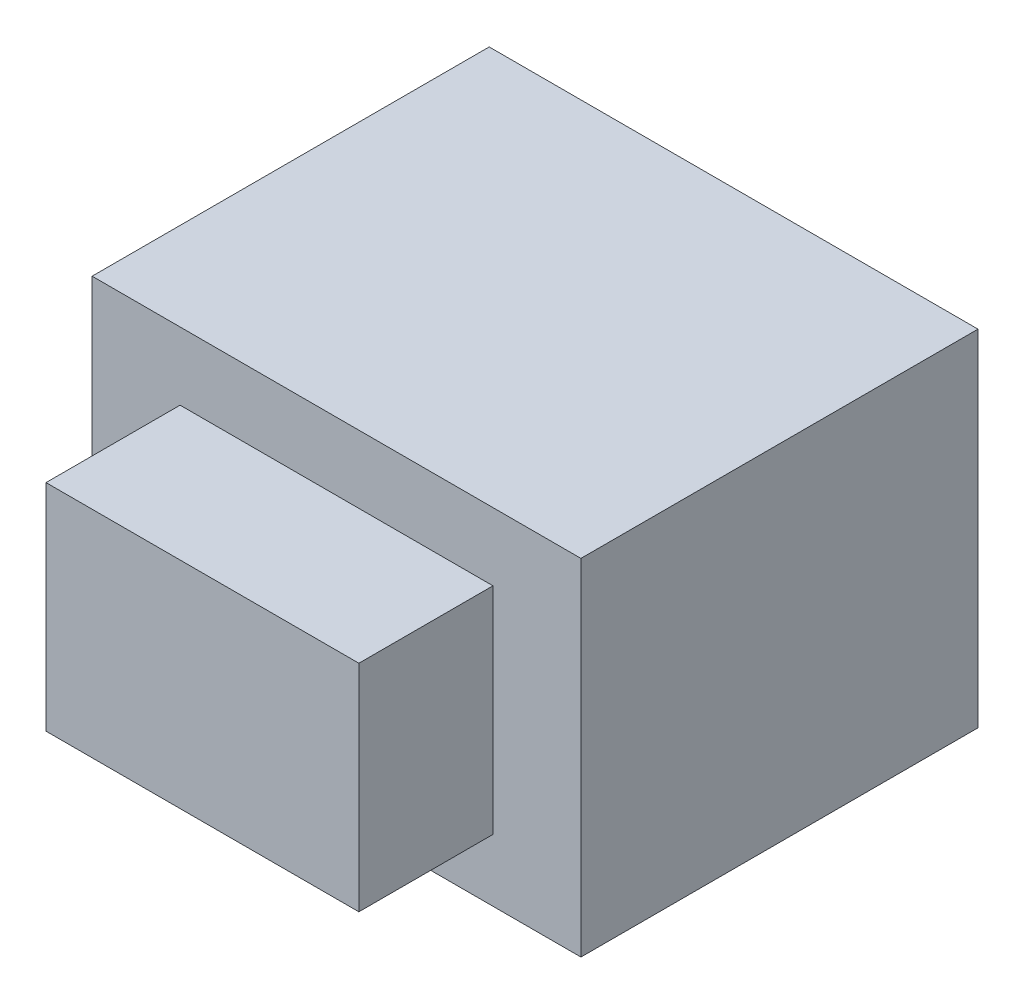
ISO-10303-21;
HEADER;
FILE_DESCRIPTION(('STEP AP214'),'2;1');
FILE_NAME('part.step','',(''),(''),'','','');
FILE_SCHEMA(('AUTOMOTIVE_DESIGN { 1 0 10303 214 1 1 1 1 }'));
ENDSEC;
DATA;
#1=APPLICATION_CONTEXT('core data for automotive mechanical design processes');
#2=APPLICATION_PROTOCOL_DEFINITION('international standard','automotive_design',2000,#1);
#3=PRODUCT_CONTEXT('',#1,'mechanical');
#4=PRODUCT('Part','Part','',(#3));
#5=PRODUCT_RELATED_PRODUCT_CATEGORY('part','',(#4));
#6=PRODUCT_DEFINITION_FORMATION('','',#4);
#7=PRODUCT_DEFINITION_CONTEXT('part definition',#1,'design');
#8=PRODUCT_DEFINITION('design','',#6,#7);
#9=PRODUCT_DEFINITION_SHAPE('','',#8);
#10=(LENGTH_UNIT() NAMED_UNIT(*) SI_UNIT(.MILLI.,.METRE.));
#11=(NAMED_UNIT(*) PLANE_ANGLE_UNIT() SI_UNIT($,.RADIAN.));
#12=(NAMED_UNIT(*) SI_UNIT($,.STERADIAN.) SOLID_ANGLE_UNIT());
#13=UNCERTAINTY_MEASURE_WITH_UNIT(LENGTH_MEASURE(1.E-05),#10,'distance_accuracy_value','');
#14=(GEOMETRIC_REPRESENTATION_CONTEXT(3) GLOBAL_UNCERTAINTY_ASSIGNED_CONTEXT((#13)) GLOBAL_UNIT_ASSIGNED_CONTEXT((#10,
#11,#12)) REPRESENTATION_CONTEXT('',''));
#15=CARTESIAN_POINT('',(0.,0.,0.));
#16=DIRECTION('',(0.,0.,1.));
#17=DIRECTION('',(1.,0.,0.));
#18=AXIS2_PLACEMENT_3D('',#15,#16,#17);
#19=CARTESIAN_POINT('',(0.,25.7503008676546,0.));
#20=DIRECTION('',(0.,0.,-1.));
#21=DIRECTION('',(-1.,0.,0.));
#22=AXIS2_PLACEMENT_3D('',#19,#20,#21);
#23=PLANE('',#22);
#24=DIRECTION('',(1.,0.,0.));
#25=VECTOR('',#24,1.);
#26=CARTESIAN_POINT('',(0.,0.,0.));
#27=LINE('',#26,#25);
#28=CARTESIAN_POINT('',(0.,0.,0.));
#29=VERTEX_POINT('',#28);
#30=CARTESIAN_POINT('',(36.453071333995,0.,0.));
#31=VERTEX_POINT('',#30);
#32=EDGE_CURVE('E139',#29,#31,#27,.T.);
#33=ORIENTED_EDGE('',*,*,#32,.T.);
#34=DIRECTION('',(0.,-1.,0.));
#35=VECTOR('',#34,1.);
#36=CARTESIAN_POINT('',(36.453071333995,25.7503008676546,0.));
#37=LINE('',#36,#35);
#38=CARTESIAN_POINT('',(36.453071333995,25.7503008676546,0.));
#39=VERTEX_POINT('',#38);
#40=EDGE_CURVE('E54',#39,#31,#37,.T.);
#41=ORIENTED_EDGE('',*,*,#40,.F.);
#42=DIRECTION('',(1.,0.,0.));
#43=VECTOR('',#42,1.);
#44=CARTESIAN_POINT('',(0.,25.7503008676546,0.));
#45=LINE('',#44,#43);
#46=CARTESIAN_POINT('',(0.,25.7503008676546,0.));
#47=VERTEX_POINT('',#46);
#48=EDGE_CURVE('E149',#47,#39,#45,.T.);
#49=ORIENTED_EDGE('',*,*,#48,.F.);
#50=DIRECTION('',(0.,-1.,0.));
#51=VECTOR('',#50,1.);
#52=CARTESIAN_POINT('',(0.,25.7503008676546,0.));
#53=LINE('',#52,#51);
#54=EDGE_CURVE('E11',#47,#29,#53,.T.);
#55=ORIENTED_EDGE('',*,*,#54,.T.);
#56=EDGE_LOOP('',(#33,#41,#49,#55));
#57=FACE_BOUND('',#56,.T.);
#58=DIRECTION('',(0.,-1.,0.));
#59=VECTOR('',#58,1.);
#60=CARTESIAN_POINT('',(6.55998389330817,20.6990312634811,0.));
#61=LINE('',#60,#59);
#62=CARTESIAN_POINT('',(6.55998389330817,20.6990312634811,0.));
#63=VERTEX_POINT('',#62);
#64=CARTESIAN_POINT('',(6.55998389330817,4.64308377295819,0.));
#65=VERTEX_POINT('',#64);
#66=EDGE_CURVE('E61',#63,#65,#61,.T.);
#67=ORIENTED_EDGE('',*,*,#66,.F.);
#68=DIRECTION('',(-1.,0.,0.));
#69=VECTOR('',#68,1.);
#70=CARTESIAN_POINT('',(6.55998389330817,20.6990312634811,0.));
#71=LINE('',#70,#69);
#72=CARTESIAN_POINT('',(29.8930874406869,20.6990312634811,0.));
#73=VERTEX_POINT('',#72);
#74=EDGE_CURVE('E65',#73,#63,#71,.T.);
#75=ORIENTED_EDGE('',*,*,#74,.F.);
#76=DIRECTION('',(0.,1.,0.));
#77=VECTOR('',#76,1.);
#78=CARTESIAN_POINT('',(29.8930874406869,20.6990312634811,0.));
#79=LINE('',#78,#77);
#80=CARTESIAN_POINT('',(29.8930874406869,4.64308377295819,0.));
#81=VERTEX_POINT('',#80);
#82=EDGE_CURVE('E289',#81,#73,#79,.T.);
#83=ORIENTED_EDGE('',*,*,#82,.F.);
#84=DIRECTION('',(1.,0.,0.));
#85=VECTOR('',#84,1.);
#86=CARTESIAN_POINT('',(6.55998389330817,4.64308377295819,0.));
#87=LINE('',#86,#85);
#88=EDGE_CURVE('E299',#65,#81,#87,.T.);
#89=ORIENTED_EDGE('',*,*,#88,.F.);
#90=EDGE_LOOP('',(#67,#75,#83,#89));
#91=FACE_BOUND('',#90,.T.);
#92=ADVANCED_FACE('F45',(#57,#91),#23,.F.);
#93=CARTESIAN_POINT('',(0.,25.7503008676546,0.));
#94=DIRECTION('',(1.,0.,0.));
#95=DIRECTION('',(0.,0.,-1.));
#96=AXIS2_PLACEMENT_3D('',#93,#94,#95);
#97=PLANE('',#96);
#98=DIRECTION('',(0.,0.,1.));
#99=VECTOR('',#98,1.);
#100=CARTESIAN_POINT('',(0.,0.,0.));
#101=LINE('',#100,#99);
#102=CARTESIAN_POINT('',(0.,0.,-29.6127087796349));
#103=VERTEX_POINT('',#102);
#104=EDGE_CURVE('E134',#103,#29,#101,.T.);
#105=ORIENTED_EDGE('',*,*,#104,.T.);
#106=ORIENTED_EDGE('',*,*,#54,.F.);
#107=DIRECTION('',(0.,0.,1.));
#108=VECTOR('',#107,1.);
#109=CARTESIAN_POINT('',(0.,25.7503008676546,0.));
#110=LINE('',#109,#108);
#111=CARTESIAN_POINT('',(0.,25.7503008676546,-29.6127087796349));
#112=VERTEX_POINT('',#111);
#113=EDGE_CURVE('E145',#112,#47,#110,.T.);
#114=ORIENTED_EDGE('',*,*,#113,.F.);
#115=DIRECTION('',(0.,-1.,0.));
#116=VECTOR('',#115,1.);
#117=CARTESIAN_POINT('',(0.,25.7503008676546,-29.6127087796349));
#118=LINE('',#117,#116);
#119=EDGE_CURVE('E158',#112,#103,#118,.T.);
#120=ORIENTED_EDGE('',*,*,#119,.T.);
#121=EDGE_LOOP('',(#105,#106,#114,#120));
#122=FACE_BOUND('',#121,.T.);
#123=ADVANCED_FACE('F47',(#122),#97,.F.);
#124=CARTESIAN_POINT('',(36.453071333995,25.7503008676546,0.));
#125=DIRECTION('',(-1.,0.,0.));
#126=DIRECTION('',(0.,0.,1.));
#127=AXIS2_PLACEMENT_3D('',#124,#125,#126);
#128=PLANE('',#127);
#129=DIRECTION('',(0.,0.,-1.));
#130=VECTOR('',#129,1.);
#131=CARTESIAN_POINT('',(36.453071333995,0.,0.));
#132=LINE('',#131,#130);
#133=CARTESIAN_POINT('',(36.453071333995,0.,-29.6127087796349));
#134=VERTEX_POINT('',#133);
#135=EDGE_CURVE('E162',#31,#134,#132,.T.);
#136=ORIENTED_EDGE('',*,*,#135,.T.);
#137=DIRECTION('',(0.,-1.,0.));
#138=VECTOR('',#137,1.);
#139=CARTESIAN_POINT('',(36.453071333995,25.7503008676546,-29.6127087796349));
#140=LINE('',#139,#138);
#141=CARTESIAN_POINT('',(36.453071333995,25.7503008676546,-29.6127087796349));
#142=VERTEX_POINT('',#141);
#143=EDGE_CURVE('E170',#142,#134,#140,.T.);
#144=ORIENTED_EDGE('',*,*,#143,.F.);
#145=DIRECTION('',(0.,0.,-1.));
#146=VECTOR('',#145,1.);
#147=CARTESIAN_POINT('',(36.453071333995,25.7503008676546,0.));
#148=LINE('',#147,#146);
#149=EDGE_CURVE('E153',#39,#142,#148,.T.);
#150=ORIENTED_EDGE('',*,*,#149,.F.);
#151=ORIENTED_EDGE('',*,*,#40,.T.);
#152=EDGE_LOOP('',(#136,#144,#150,#151));
#153=FACE_BOUND('',#152,.T.);
#154=ADVANCED_FACE('F179',(#153),#128,.F.);
#155=CARTESIAN_POINT('',(0.,25.7503008676546,-29.6127087796349));
#156=DIRECTION('',(0.,0.,1.));
#157=DIRECTION('',(1.,0.,0.));
#158=AXIS2_PLACEMENT_3D('',#155,#156,#157);
#159=PLANE('',#158);
#160=DIRECTION('',(-1.,0.,0.));
#161=VECTOR('',#160,1.);
#162=CARTESIAN_POINT('',(0.,0.,-29.6127087796349));
#163=LINE('',#162,#161);
#164=EDGE_CURVE('E150',#134,#103,#163,.T.);
#165=ORIENTED_EDGE('',*,*,#164,.T.);
#166=ORIENTED_EDGE('',*,*,#119,.F.);
#167=DIRECTION('',(-1.,0.,0.));
#168=VECTOR('',#167,1.);
#169=CARTESIAN_POINT('',(0.,25.7503008676546,-29.6127087796349));
#170=LINE('',#169,#168);
#171=EDGE_CURVE('E156',#142,#112,#170,.T.);
#172=ORIENTED_EDGE('',*,*,#171,.F.);
#173=ORIENTED_EDGE('',*,*,#143,.T.);
#174=EDGE_LOOP('',(#165,#166,#172,#173));
#175=FACE_BOUND('',#174,.T.);
#176=ADVANCED_FACE('F188',(#175),#159,.F.);
#177=CARTESIAN_POINT('',(0.,25.7503008676546,0.));
#178=DIRECTION('',(0.,-1.,0.));
#179=DIRECTION('',(0.,0.,-1.));
#180=AXIS2_PLACEMENT_3D('',#177,#178,#179);
#181=PLANE('',#180);
#182=ORIENTED_EDGE('',*,*,#113,.T.);
#183=ORIENTED_EDGE('',*,*,#48,.T.);
#184=ORIENTED_EDGE('',*,*,#149,.T.);
#185=ORIENTED_EDGE('',*,*,#171,.T.);
#186=EDGE_LOOP('',(#182,#183,#184,#185));
#187=FACE_BOUND('',#186,.T.);
#188=ADVANCED_FACE('F194',(#187),#181,.F.);
#189=CARTESIAN_POINT('',(0.,0.,0.));
#190=DIRECTION('',(0.,-1.,0.));
#191=DIRECTION('',(0.,0.,-1.));
#192=AXIS2_PLACEMENT_3D('',#189,#190,#191);
#193=PLANE('',#192);
#194=ORIENTED_EDGE('',*,*,#104,.F.);
#195=ORIENTED_EDGE('',*,*,#164,.F.);
#196=ORIENTED_EDGE('',*,*,#135,.F.);
#197=ORIENTED_EDGE('',*,*,#32,.F.);
#198=EDGE_LOOP('',(#194,#195,#196,#197));
#199=FACE_BOUND('',#198,.T.);
#200=ADVANCED_FACE('F185',(#199),#193,.T.);
#201=CARTESIAN_POINT('',(6.55998389330817,20.6990312634811,10.));
#202=DIRECTION('',(1.,0.,0.));
#203=DIRECTION('',(0.,0.,-1.));
#204=AXIS2_PLACEMENT_3D('',#201,#202,#203);
#205=PLANE('',#204);
#206=ORIENTED_EDGE('',*,*,#66,.T.);
#207=DIRECTION('',(0.,0.,-1.));
#208=VECTOR('',#207,1.);
#209=CARTESIAN_POINT('',(6.55998389330817,4.64308377295819,10.));
#210=LINE('',#209,#208);
#211=CARTESIAN_POINT('',(6.55998389330817,4.64308377295819,10.));
#212=VERTEX_POINT('',#211);
#213=EDGE_CURVE('E114',#212,#65,#210,.T.);
#214=ORIENTED_EDGE('',*,*,#213,.F.);
#215=DIRECTION('',(0.,-1.,0.));
#216=VECTOR('',#215,1.);
#217=CARTESIAN_POINT('',(6.55998389330817,20.6990312634811,10.));
#218=LINE('',#217,#216);
#219=CARTESIAN_POINT('',(6.55998389330817,20.6990312634811,10.));
#220=VERTEX_POINT('',#219);
#221=EDGE_CURVE('E121',#220,#212,#218,.T.);
#222=ORIENTED_EDGE('',*,*,#221,.F.);
#223=DIRECTION('',(0.,0.,-1.));
#224=VECTOR('',#223,1.);
#225=CARTESIAN_POINT('',(6.55998389330817,20.6990312634811,10.));
#226=LINE('',#225,#224);
#227=EDGE_CURVE('E286',#220,#63,#226,.T.);
#228=ORIENTED_EDGE('',*,*,#227,.T.);
#229=EDGE_LOOP('',(#206,#214,#222,#228));
#230=FACE_BOUND('',#229,.T.);
#231=ADVANCED_FACE('F132',(#230),#205,.F.);
#232=CARTESIAN_POINT('',(6.55998389330817,4.64308377295819,10.));
#233=DIRECTION('',(0.,1.,0.));
#234=DIRECTION('',(0.,0.,1.));
#235=AXIS2_PLACEMENT_3D('',#232,#233,#234);
#236=PLANE('',#235);
#237=ORIENTED_EDGE('',*,*,#88,.T.);
#238=DIRECTION('',(0.,0.,-1.));
#239=VECTOR('',#238,1.);
#240=CARTESIAN_POINT('',(29.8930874406869,4.64308377295819,10.));
#241=LINE('',#240,#239);
#242=CARTESIAN_POINT('',(29.8930874406869,4.64308377295819,10.));
#243=VERTEX_POINT('',#242);
#244=EDGE_CURVE('E116',#243,#81,#241,.T.);
#245=ORIENTED_EDGE('',*,*,#244,.F.);
#246=DIRECTION('',(1.,0.,0.));
#247=VECTOR('',#246,1.);
#248=CARTESIAN_POINT('',(6.55998389330817,4.64308377295819,10.));
#249=LINE('',#248,#247);
#250=EDGE_CURVE('E109',#212,#243,#249,.T.);
#251=ORIENTED_EDGE('',*,*,#250,.F.);
#252=ORIENTED_EDGE('',*,*,#213,.T.);
#253=EDGE_LOOP('',(#237,#245,#251,#252));
#254=FACE_BOUND('',#253,.T.);
#255=ADVANCED_FACE('F112',(#254),#236,.F.);
#256=CARTESIAN_POINT('',(29.8930874406869,20.6990312634811,10.));
#257=DIRECTION('',(-1.,0.,0.));
#258=DIRECTION('',(0.,0.,1.));
#259=AXIS2_PLACEMENT_3D('',#256,#257,#258);
#260=PLANE('',#259);
#261=ORIENTED_EDGE('',*,*,#82,.T.);
#262=DIRECTION('',(0.,0.,-1.));
#263=VECTOR('',#262,1.);
#264=CARTESIAN_POINT('',(29.8930874406869,20.6990312634811,10.));
#265=LINE('',#264,#263);
#266=CARTESIAN_POINT('',(29.8930874406869,20.6990312634811,10.));
#267=VERTEX_POINT('',#266);
#268=EDGE_CURVE('E141',#267,#73,#265,.T.);
#269=ORIENTED_EDGE('',*,*,#268,.F.);
#270=DIRECTION('',(0.,1.,0.));
#271=VECTOR('',#270,1.);
#272=CARTESIAN_POINT('',(29.8930874406869,20.6990312634811,10.));
#273=LINE('',#272,#271);
#274=EDGE_CURVE('E120',#243,#267,#273,.T.);
#275=ORIENTED_EDGE('',*,*,#274,.F.);
#276=ORIENTED_EDGE('',*,*,#244,.T.);
#277=EDGE_LOOP('',(#261,#269,#275,#276));
#278=FACE_BOUND('',#277,.T.);
#279=ADVANCED_FACE('F212',(#278),#260,.F.);
#280=CARTESIAN_POINT('',(6.55998389330817,20.6990312634811,10.));
#281=DIRECTION('',(0.,-1.,0.));
#282=DIRECTION('',(0.,0.,-1.));
#283=AXIS2_PLACEMENT_3D('',#280,#281,#282);
#284=PLANE('',#283);
#285=ORIENTED_EDGE('',*,*,#74,.T.);
#286=ORIENTED_EDGE('',*,*,#227,.F.);
#287=DIRECTION('',(-1.,0.,0.));
#288=VECTOR('',#287,1.);
#289=CARTESIAN_POINT('',(6.55998389330817,20.6990312634811,10.));
#290=LINE('',#289,#288);
#291=EDGE_CURVE('E126',#267,#220,#290,.T.);
#292=ORIENTED_EDGE('',*,*,#291,.F.);
#293=ORIENTED_EDGE('',*,*,#268,.T.);
#294=EDGE_LOOP('',(#285,#286,#292,#293));
#295=FACE_BOUND('',#294,.T.);
#296=ADVANCED_FACE('F215',(#295),#284,.F.);
#297=CARTESIAN_POINT('',(0.,0.,10.));
#298=DIRECTION('',(0.,0.,1.));
#299=DIRECTION('',(1.,0.,0.));
#300=AXIS2_PLACEMENT_3D('',#297,#298,#299);
#301=PLANE('',#300);
#302=ORIENTED_EDGE('',*,*,#221,.T.);
#303=ORIENTED_EDGE('',*,*,#250,.T.);
#304=ORIENTED_EDGE('',*,*,#274,.T.);
#305=ORIENTED_EDGE('',*,*,#291,.T.);
#306=EDGE_LOOP('',(#302,#303,#304,#305));
#307=FACE_BOUND('',#306,.T.);
#308=ADVANCED_FACE('F124',(#307),#301,.T.);
#309=CLOSED_SHELL('',(#92,#123,#154,#176,#188,#200,#231,#255,#279,#296,#308));
#310=MANIFOLD_SOLID_BREP('B2',#309);
#311=ADVANCED_BREP_SHAPE_REPRESENTATION('',(#18,#310),#14);
#312=SHAPE_DEFINITION_REPRESENTATION(#9,#311);
ENDSEC;
END-ISO-10303-21;
